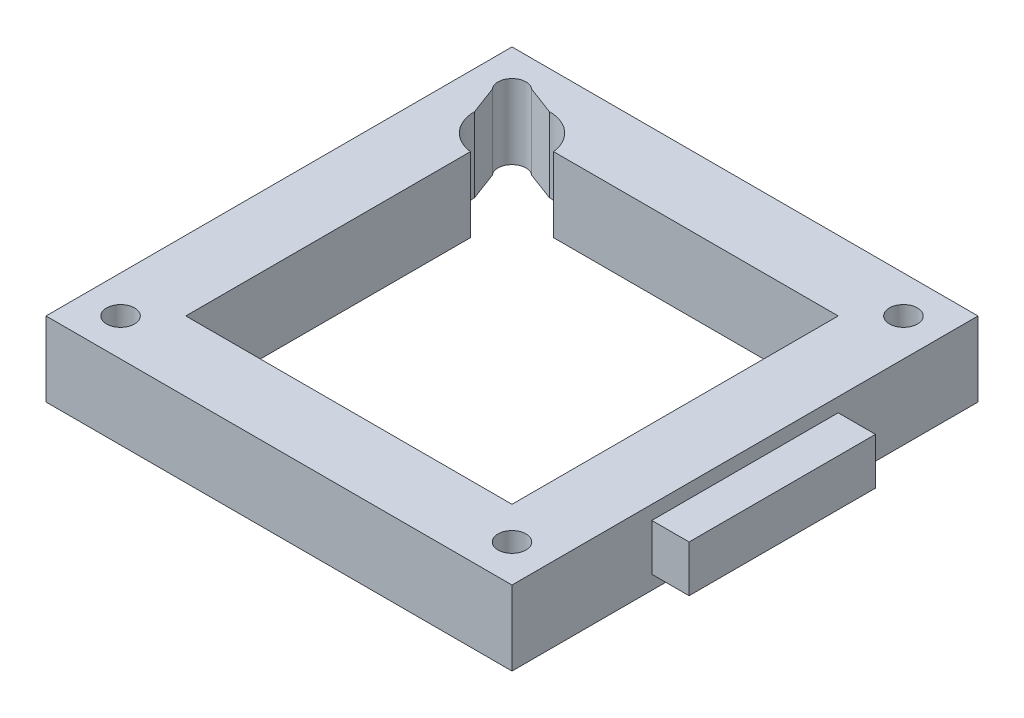
ISO-10303-21;
HEADER;
FILE_DESCRIPTION(('STEP AP214'),'2;1');
FILE_NAME('part.step','',(''),(''),'','','');
FILE_SCHEMA(('AUTOMOTIVE_DESIGN { 1 0 10303 214 1 1 1 1 }'));
ENDSEC;
DATA;
#1=APPLICATION_CONTEXT('core data for automotive mechanical design processes');
#2=APPLICATION_PROTOCOL_DEFINITION('international standard','automotive_design',2000,#1);
#3=PRODUCT_CONTEXT('',#1,'mechanical');
#4=PRODUCT('Part','Part','',(#3));
#5=PRODUCT_RELATED_PRODUCT_CATEGORY('part','',(#4));
#6=PRODUCT_DEFINITION_FORMATION('','',#4);
#7=PRODUCT_DEFINITION_CONTEXT('part definition',#1,'design');
#8=PRODUCT_DEFINITION('design','',#6,#7);
#9=PRODUCT_DEFINITION_SHAPE('','',#8);
#10=(LENGTH_UNIT() NAMED_UNIT(*) SI_UNIT(.MILLI.,.METRE.));
#11=(NAMED_UNIT(*) PLANE_ANGLE_UNIT() SI_UNIT($,.RADIAN.));
#12=(NAMED_UNIT(*) SI_UNIT($,.STERADIAN.) SOLID_ANGLE_UNIT());
#13=UNCERTAINTY_MEASURE_WITH_UNIT(LENGTH_MEASURE(1.E-05),#10,'distance_accuracy_value','');
#14=(GEOMETRIC_REPRESENTATION_CONTEXT(3) GLOBAL_UNCERTAINTY_ASSIGNED_CONTEXT((#13)) GLOBAL_UNIT_ASSIGNED_CONTEXT((#10,
#11,#12)) REPRESENTATION_CONTEXT('',''));
#15=CARTESIAN_POINT('',(0.,0.,0.));
#16=DIRECTION('',(0.,0.,1.));
#17=DIRECTION('',(1.,0.,0.));
#18=AXIS2_PLACEMENT_3D('',#15,#16,#17);
#19=CARTESIAN_POINT('',(25.,8.,0.));
#20=DIRECTION('',(-1.,0.,0.));
#21=DIRECTION('',(0.,0.,1.));
#22=AXIS2_PLACEMENT_3D('',#19,#20,#21);
#23=PLANE('',#22);
#24=DIRECTION('',(0.,0.,-1.));
#25=VECTOR('',#24,1.);
#26=CARTESIAN_POINT('',(25.,0.,0.));
#27=LINE('',#26,#25);
#28=CARTESIAN_POINT('',(25.,0.,25.));
#29=VERTEX_POINT('',#28);
#30=CARTESIAN_POINT('',(25.,0.,-25.));
#31=VERTEX_POINT('',#30);
#32=EDGE_CURVE('E437',#29,#31,#27,.T.);
#33=ORIENTED_EDGE('',*,*,#32,.T.);
#34=DIRECTION('',(0.,-1.,0.));
#35=VECTOR('',#34,1.);
#36=CARTESIAN_POINT('',(25.,8.,-25.));
#37=LINE('',#36,#35);
#38=CARTESIAN_POINT('',(25.,8.,-25.));
#39=VERTEX_POINT('',#38);
#40=EDGE_CURVE('E59',#39,#31,#37,.T.);
#41=ORIENTED_EDGE('',*,*,#40,.F.);
#42=DIRECTION('',(0.,0.,-1.));
#43=VECTOR('',#42,1.);
#44=CARTESIAN_POINT('',(25.,8.,0.));
#45=LINE('',#44,#43);
#46=CARTESIAN_POINT('',(25.,8.,25.));
#47=VERTEX_POINT('',#46);
#48=EDGE_CURVE('E377',#47,#39,#45,.T.);
#49=ORIENTED_EDGE('',*,*,#48,.F.);
#50=DIRECTION('',(0.,-1.,0.));
#51=VECTOR('',#50,1.);
#52=CARTESIAN_POINT('',(25.,8.,25.));
#53=LINE('',#52,#51);
#54=EDGE_CURVE('E11',#47,#29,#53,.T.);
#55=ORIENTED_EDGE('',*,*,#54,.T.);
#56=EDGE_LOOP('',(#33,#41,#49,#55));
#57=FACE_BOUND('',#56,.T.);
#58=DIRECTION('',(0.,0.,-1.));
#59=VECTOR('',#58,1.);
#60=CARTESIAN_POINT('',(25.,1.50000000000004,0.));
#61=LINE('',#60,#59);
#62=CARTESIAN_POINT('',(25.,1.5,10.));
#63=VERTEX_POINT('',#62);
#64=CARTESIAN_POINT('',(25.,1.50000000000007,-10.));
#65=VERTEX_POINT('',#64);
#66=EDGE_CURVE('E67',#63,#65,#61,.T.);
#67=ORIENTED_EDGE('',*,*,#66,.F.);
#68=DIRECTION('',(0.,-1.,0.));
#69=VECTOR('',#68,1.);
#70=CARTESIAN_POINT('',(25.,8.,10.));
#71=LINE('',#70,#69);
#72=CARTESIAN_POINT('',(25.,6.5,10.));
#73=VERTEX_POINT('',#72);
#74=EDGE_CURVE('E71',#73,#63,#71,.T.);
#75=ORIENTED_EDGE('',*,*,#74,.F.);
#76=DIRECTION('',(0.,0.,1.));
#77=VECTOR('',#76,1.);
#78=CARTESIAN_POINT('',(25.,6.5,0.));
#79=LINE('',#78,#77);
#80=CARTESIAN_POINT('',(25.,6.5,-10.));
#81=VERTEX_POINT('',#80);
#82=EDGE_CURVE('E997',#81,#73,#79,.T.);
#83=ORIENTED_EDGE('',*,*,#82,.F.);
#84=DIRECTION('',(0.,1.,0.));
#85=VECTOR('',#84,1.);
#86=CARTESIAN_POINT('',(25.,8.,-10.));
#87=LINE('',#86,#85);
#88=EDGE_CURVE('E1007',#65,#81,#87,.T.);
#89=ORIENTED_EDGE('',*,*,#88,.F.);
#90=EDGE_LOOP('',(#67,#75,#83,#89));
#91=FACE_BOUND('',#90,.T.);
#92=ADVANCED_FACE('F49',(#57,#91),#23,.F.);
#93=CARTESIAN_POINT('',(0.,8.,25.));
#94=DIRECTION('',(0.,0.,-1.));
#95=DIRECTION('',(-1.,0.,0.));
#96=AXIS2_PLACEMENT_3D('',#93,#94,#95);
#97=PLANE('',#96);
#98=DIRECTION('',(1.,0.,0.));
#99=VECTOR('',#98,1.);
#100=CARTESIAN_POINT('',(0.,0.,25.));
#101=LINE('',#100,#99);
#102=CARTESIAN_POINT('',(-25.,0.,25.));
#103=VERTEX_POINT('',#102);
#104=EDGE_CURVE('E433',#103,#29,#101,.T.);
#105=ORIENTED_EDGE('',*,*,#104,.T.);
#106=ORIENTED_EDGE('',*,*,#54,.F.);
#107=DIRECTION('',(1.,0.,0.));
#108=VECTOR('',#107,1.);
#109=CARTESIAN_POINT('',(0.,8.,25.));
#110=LINE('',#109,#108);
#111=CARTESIAN_POINT('',(-25.,8.,25.));
#112=VERTEX_POINT('',#111);
#113=EDGE_CURVE('E373',#112,#47,#110,.T.);
#114=ORIENTED_EDGE('',*,*,#113,.F.);
#115=DIRECTION('',(0.,-1.,0.));
#116=VECTOR('',#115,1.);
#117=CARTESIAN_POINT('',(-25.,8.,25.));
#118=LINE('',#117,#116);
#119=EDGE_CURVE('E456',#112,#103,#118,.T.);
#120=ORIENTED_EDGE('',*,*,#119,.T.);
#121=EDGE_LOOP('',(#105,#106,#114,#120));
#122=FACE_BOUND('',#121,.T.);
#123=ADVANCED_FACE('F544',(#122),#97,.F.);
#124=CARTESIAN_POINT('',(0.,8.,-25.));
#125=DIRECTION('',(0.,0.,-1.));
#126=DIRECTION('',(-1.,0.,0.));
#127=AXIS2_PLACEMENT_3D('',#124,#125,#126);
#128=PLANE('',#127);
#129=DIRECTION('',(1.,0.,0.));
#130=VECTOR('',#129,1.);
#131=CARTESIAN_POINT('',(0.,6.5000000000053,-25.));
#132=LINE('',#131,#130);
#133=CARTESIAN_POINT('',(-10.0000000000553,6.5000000000053,-25.));
#134=VERTEX_POINT('',#133);
#135=CARTESIAN_POINT('',(9.9999999999447,6.5000000000053,-25.));
#136=VERTEX_POINT('',#135);
#137=EDGE_CURVE('E283',#134,#136,#132,.T.);
#138=ORIENTED_EDGE('',*,*,#137,.F.);
#139=DIRECTION('',(0.,1.,0.));
#140=VECTOR('',#139,1.);
#141=CARTESIAN_POINT('',(-10.0000000000553,8.,-25.));
#142=LINE('',#141,#140);
#143=CARTESIAN_POINT('',(-10.0000000000553,1.5000000000053,-25.));
#144=VERTEX_POINT('',#143);
#145=EDGE_CURVE('E298',#144,#134,#142,.T.);
#146=ORIENTED_EDGE('',*,*,#145,.F.);
#147=DIRECTION('',(-1.,0.,0.));
#148=VECTOR('',#147,1.);
#149=CARTESIAN_POINT('',(0.,1.5000000000053,-25.));
#150=LINE('',#149,#148);
#151=CARTESIAN_POINT('',(9.9999999999447,1.5000000000053,-25.));
#152=VERTEX_POINT('',#151);
#153=EDGE_CURVE('E317',#152,#144,#150,.T.);
#154=ORIENTED_EDGE('',*,*,#153,.F.);
#155=DIRECTION('',(0.,-1.,0.));
#156=VECTOR('',#155,1.);
#157=CARTESIAN_POINT('',(9.9999999999447,8.,-25.));
#158=LINE('',#157,#156);
#159=EDGE_CURVE('E313',#136,#152,#158,.T.);
#160=ORIENTED_EDGE('',*,*,#159,.F.);
#161=EDGE_LOOP('',(#138,#146,#154,#160));
#162=FACE_BOUND('',#161,.T.);
#163=DIRECTION('',(1.,0.,0.));
#164=VECTOR('',#163,1.);
#165=CARTESIAN_POINT('',(0.,0.,-25.));
#166=LINE('',#165,#164);
#167=CARTESIAN_POINT('',(-25.,0.,-25.));
#168=VERTEX_POINT('',#167);
#169=EDGE_CURVE('E441',#168,#31,#166,.T.);
#170=ORIENTED_EDGE('',*,*,#169,.F.);
#171=DIRECTION('',(0.,-1.,0.));
#172=VECTOR('',#171,1.);
#173=CARTESIAN_POINT('',(-25.,8.,-25.));
#174=LINE('',#173,#172);
#175=CARTESIAN_POINT('',(-25.,8.,-25.));
#176=VERTEX_POINT('',#175);
#177=EDGE_CURVE('E459',#176,#168,#174,.T.);
#178=ORIENTED_EDGE('',*,*,#177,.F.);
#179=DIRECTION('',(1.,0.,0.));
#180=VECTOR('',#179,1.);
#181=CARTESIAN_POINT('',(0.,8.,-25.));
#182=LINE('',#181,#180);
#183=EDGE_CURVE('E380',#176,#39,#182,.T.);
#184=ORIENTED_EDGE('',*,*,#183,.T.);
#185=ORIENTED_EDGE('',*,*,#40,.T.);
#186=EDGE_LOOP('',(#170,#178,#184,#185));
#187=FACE_BOUND('',#186,.T.);
#188=ADVANCED_FACE('F542',(#162,#187),#128,.T.);
#189=CARTESIAN_POINT('',(-17.,8.,-17.));
#190=DIRECTION('',(0.,-1.,0.));
#191=DIRECTION('',(0.,0.,-1.));
#192=AXIS2_PLACEMENT_3D('',#189,#190,#191);
#193=CYLINDRICAL_SURFACE('',#192,4.);
#194=CARTESIAN_POINT('',(-17.,0.,-17.));
#195=DIRECTION('',(0.,1.,0.));
#196=DIRECTION('',(0.,0.,1.));
#197=AXIS2_PLACEMENT_3D('',#194,#195,#196);
#198=CIRCLE('',#197,4.);
#199=CARTESIAN_POINT('',(-13.0313730334031,0.,-17.5));
#200=VERTEX_POINT('',#199);
#201=CARTESIAN_POINT('',(-17.,0.,-21.));
#202=VERTEX_POINT('',#201);
#203=EDGE_CURVE('E327',#200,#202,#198,.T.);
#204=ORIENTED_EDGE('',*,*,#203,.F.);
#205=DIRECTION('',(0.,-1.,0.));
#206=VECTOR('',#205,1.);
#207=CARTESIAN_POINT('',(-13.0313730334031,8.,-17.5));
#208=LINE('',#207,#206);
#209=CARTESIAN_POINT('',(-13.0313730334031,8.,-17.5));
#210=VERTEX_POINT('',#209);
#211=EDGE_CURVE('E53',#210,#200,#208,.T.);
#212=ORIENTED_EDGE('',*,*,#211,.F.);
#213=CARTESIAN_POINT('',(-17.,8.,-17.));
#214=DIRECTION('',(0.,1.,0.));
#215=DIRECTION('',(0.,0.,1.));
#216=AXIS2_PLACEMENT_3D('',#213,#214,#215);
#217=CIRCLE('',#216,4.);
#218=CARTESIAN_POINT('',(-17.,8.,-21.));
#219=VERTEX_POINT('',#218);
#220=EDGE_CURVE('E337',#210,#219,#217,.T.);
#221=ORIENTED_EDGE('',*,*,#220,.T.);
#222=DIRECTION('',(0.,-1.,0.));
#223=VECTOR('',#222,1.);
#224=CARTESIAN_POINT('',(-17.,8.,-21.));
#225=LINE('',#224,#223);
#226=EDGE_CURVE('E396',#219,#202,#225,.T.);
#227=ORIENTED_EDGE('',*,*,#226,.T.);
#228=EDGE_LOOP('',(#204,#212,#221,#227));
#229=FACE_BOUND('',#228,.T.);
#230=ADVANCED_FACE('F494',(#229),#193,.F.);
#231=CARTESIAN_POINT('',(0.,8.,-17.5));
#232=DIRECTION('',(0.,0.,1.));
#233=DIRECTION('',(1.,0.,0.));
#234=AXIS2_PLACEMENT_3D('',#231,#232,#233);
#235=PLANE('',#234);
#236=DIRECTION('',(-1.,0.,0.));
#237=VECTOR('',#236,1.);
#238=CARTESIAN_POINT('',(0.,0.,-17.5));
#239=LINE('',#238,#237);
#240=CARTESIAN_POINT('',(17.5,0.,-17.5));
#241=VERTEX_POINT('',#240);
#242=EDGE_CURVE('E400',#241,#200,#239,.T.);
#243=ORIENTED_EDGE('',*,*,#242,.F.);
#244=DIRECTION('',(0.,-1.,0.));
#245=VECTOR('',#244,1.);
#246=CARTESIAN_POINT('',(17.5,8.,-17.5));
#247=LINE('',#246,#245);
#248=CARTESIAN_POINT('',(17.5,8.,-17.5));
#249=VERTEX_POINT('',#248);
#250=EDGE_CURVE('E483',#249,#241,#247,.T.);
#251=ORIENTED_EDGE('',*,*,#250,.F.);
#252=DIRECTION('',(-1.,0.,0.));
#253=VECTOR('',#252,1.);
#254=CARTESIAN_POINT('',(0.,8.,-17.5));
#255=LINE('',#254,#253);
#256=EDGE_CURVE('E341',#249,#210,#255,.T.);
#257=ORIENTED_EDGE('',*,*,#256,.T.);
#258=ORIENTED_EDGE('',*,*,#211,.T.);
#259=EDGE_LOOP('',(#243,#251,#257,#258));
#260=FACE_BOUND('',#259,.T.);
#261=ADVANCED_FACE('F51',(#260),#235,.T.);
#262=CARTESIAN_POINT('',(17.5,8.,0.));
#263=DIRECTION('',(-1.,0.,0.));
#264=DIRECTION('',(0.,0.,1.));
#265=AXIS2_PLACEMENT_3D('',#262,#263,#264);
#266=PLANE('',#265);
#267=DIRECTION('',(0.,0.,-1.));
#268=VECTOR('',#267,1.);
#269=CARTESIAN_POINT('',(17.5,0.,0.));
#270=LINE('',#269,#268);
#271=CARTESIAN_POINT('',(17.5,0.,17.5));
#272=VERTEX_POINT('',#271);
#273=EDGE_CURVE('E405',#272,#241,#270,.T.);
#274=ORIENTED_EDGE('',*,*,#273,.F.);
#275=DIRECTION('',(0.,-1.,0.));
#276=VECTOR('',#275,1.);
#277=CARTESIAN_POINT('',(17.5,8.,17.5));
#278=LINE('',#277,#276);
#279=CARTESIAN_POINT('',(17.5,8.,17.5));
#280=VERTEX_POINT('',#279);
#281=EDGE_CURVE('E481',#280,#272,#278,.T.);
#282=ORIENTED_EDGE('',*,*,#281,.F.);
#283=DIRECTION('',(0.,0.,-1.));
#284=VECTOR('',#283,1.);
#285=CARTESIAN_POINT('',(17.5,8.,0.));
#286=LINE('',#285,#284);
#287=EDGE_CURVE('E347',#280,#249,#286,.T.);
#288=ORIENTED_EDGE('',*,*,#287,.T.);
#289=ORIENTED_EDGE('',*,*,#250,.T.);
#290=EDGE_LOOP('',(#274,#282,#288,#289));
#291=FACE_BOUND('',#290,.T.);
#292=ADVANCED_FACE('F502',(#291),#266,.T.);
#293=CARTESIAN_POINT('',(0.,8.,17.5));
#294=DIRECTION('',(0.,0.,-1.));
#295=DIRECTION('',(-1.,0.,0.));
#296=AXIS2_PLACEMENT_3D('',#293,#294,#295);
#297=PLANE('',#296);
#298=DIRECTION('',(1.,0.,0.));
#299=VECTOR('',#298,1.);
#300=CARTESIAN_POINT('',(0.,0.,17.5));
#301=LINE('',#300,#299);
#302=CARTESIAN_POINT('',(-17.5,0.,17.5));
#303=VERTEX_POINT('',#302);
#304=EDGE_CURVE('E409',#303,#272,#301,.T.);
#305=ORIENTED_EDGE('',*,*,#304,.F.);
#306=DIRECTION('',(0.,-1.,0.));
#307=VECTOR('',#306,1.);
#308=CARTESIAN_POINT('',(-17.5,8.,17.5));
#309=LINE('',#308,#307);
#310=CARTESIAN_POINT('',(-17.5,8.,17.5));
#311=VERTEX_POINT('',#310);
#312=EDGE_CURVE('E478',#311,#303,#309,.T.);
#313=ORIENTED_EDGE('',*,*,#312,.F.);
#314=DIRECTION('',(1.,0.,0.));
#315=VECTOR('',#314,1.);
#316=CARTESIAN_POINT('',(0.,8.,17.5));
#317=LINE('',#316,#315);
#318=EDGE_CURVE('E351',#311,#280,#317,.T.);
#319=ORIENTED_EDGE('',*,*,#318,.T.);
#320=ORIENTED_EDGE('',*,*,#281,.T.);
#321=EDGE_LOOP('',(#305,#313,#319,#320));
#322=FACE_BOUND('',#321,.T.);
#323=ADVANCED_FACE('F509',(#322),#297,.T.);
#324=CARTESIAN_POINT('',(-17.5,8.,0.));
#325=DIRECTION('',(-1.,0.,0.));
#326=DIRECTION('',(0.,0.,1.));
#327=AXIS2_PLACEMENT_3D('',#324,#325,#326);
#328=PLANE('',#327);
#329=DIRECTION('',(0.,0.,-1.));
#330=VECTOR('',#329,1.);
#331=CARTESIAN_POINT('',(-17.5,0.,0.));
#332=LINE('',#331,#330);
#333=CARTESIAN_POINT('',(-17.5,0.,-13.0313730334031));
#334=VERTEX_POINT('',#333);
#335=EDGE_CURVE('E413',#303,#334,#332,.T.);
#336=ORIENTED_EDGE('',*,*,#335,.T.);
#337=DIRECTION('',(0.,-1.,0.));
#338=VECTOR('',#337,1.);
#339=CARTESIAN_POINT('',(-17.5,8.,-13.0313730334031));
#340=LINE('',#339,#338);
#341=CARTESIAN_POINT('',(-17.5,8.,-13.0313730334031));
#342=VERTEX_POINT('',#341);
#343=EDGE_CURVE('E475',#342,#334,#340,.T.);
#344=ORIENTED_EDGE('',*,*,#343,.F.);
#345=DIRECTION('',(0.,0.,-1.));
#346=VECTOR('',#345,1.);
#347=CARTESIAN_POINT('',(-17.5,8.,0.));
#348=LINE('',#347,#346);
#349=EDGE_CURVE('E355',#311,#342,#348,.T.);
#350=ORIENTED_EDGE('',*,*,#349,.F.);
#351=ORIENTED_EDGE('',*,*,#312,.T.);
#352=EDGE_LOOP('',(#336,#344,#350,#351));
#353=FACE_BOUND('',#352,.T.);
#354=ADVANCED_FACE('F513',(#353),#328,.F.);
#355=CARTESIAN_POINT('',(-21.,0.,-17.));
#356=VERTEX_POINT('',#355);
#357=EDGE_CURVE('E401',#356,#334,#198,.T.);
#358=ORIENTED_EDGE('',*,*,#357,.F.);
#359=DIRECTION('',(0.,-1.,0.));
#360=VECTOR('',#359,1.);
#361=CARTESIAN_POINT('',(-21.,8.,-17.));
#362=LINE('',#361,#360);
#363=CARTESIAN_POINT('',(-21.,8.,-17.));
#364=VERTEX_POINT('',#363);
#365=EDGE_CURVE('E472',#364,#356,#362,.T.);
#366=ORIENTED_EDGE('',*,*,#365,.F.);
#367=EDGE_CURVE('E343',#364,#342,#217,.T.);
#368=ORIENTED_EDGE('',*,*,#367,.T.);
#369=ORIENTED_EDGE('',*,*,#343,.T.);
#370=EDGE_LOOP('',(#358,#366,#368,#369));
#371=FACE_BOUND('',#370,.T.);
#372=ADVANCED_FACE('F532',(#371),#193,.F.);
#373=CARTESIAN_POINT('',(-12.8219178082192,8.,4.80821917808219));
#374=DIRECTION('',(0.936329177569045,0.,-0.351123441588392));
#375=DIRECTION('',(-0.351123441588392,0.,-0.936329177569045));
#376=AXIS2_PLACEMENT_3D('',#373,#374,#375);
#377=PLANE('',#376);
#378=DIRECTION('',(0.351123441588392,0.,0.936329177569044));
#379=VECTOR('',#378,1.);
#380=CARTESIAN_POINT('',(-12.8219178082192,0.,4.80821917808219));
#381=LINE('',#380,#379);
#382=CARTESIAN_POINT('',(-22.1301369863014,0.,-20.013698630137));
#383=VERTEX_POINT('',#382);
#384=EDGE_CURVE('E417',#383,#356,#381,.T.);
#385=ORIENTED_EDGE('',*,*,#384,.F.);
#386=DIRECTION('',(0.,-1.,0.));
#387=VECTOR('',#386,1.);
#388=CARTESIAN_POINT('',(-22.1301369863014,8.,-20.013698630137));
#389=LINE('',#388,#387);
#390=CARTESIAN_POINT('',(-22.1301369863014,8.,-20.013698630137));
#391=VERTEX_POINT('',#390);
#392=EDGE_CURVE('E469',#391,#383,#389,.T.);
#393=ORIENTED_EDGE('',*,*,#392,.F.);
#394=DIRECTION('',(0.351123441588392,0.,0.936329177569044));
#395=VECTOR('',#394,1.);
#396=CARTESIAN_POINT('',(-12.8219178082192,8.,4.80821917808219));
#397=LINE('',#396,#395);
#398=EDGE_CURVE('E358',#391,#364,#397,.T.);
#399=ORIENTED_EDGE('',*,*,#398,.T.);
#400=ORIENTED_EDGE('',*,*,#365,.T.);
#401=EDGE_LOOP('',(#385,#393,#399,#400));
#402=FACE_BOUND('',#401,.T.);
#403=ADVANCED_FACE('F522',(#402),#377,.T.);
#404=CARTESIAN_POINT('',(-21.,8.,-21.));
#405=DIRECTION('',(0.,-1.,0.));
#406=DIRECTION('',(0.,0.,-1.));
#407=AXIS2_PLACEMENT_3D('',#404,#405,#406);
#408=CYLINDRICAL_SURFACE('',#407,1.5);
#409=CARTESIAN_POINT('',(-21.,0.,-21.));
#410=DIRECTION('',(0.,1.,0.));
#411=DIRECTION('',(0.,0.,1.));
#412=AXIS2_PLACEMENT_3D('',#409,#410,#411);
#413=CIRCLE('',#412,1.5);
#414=CARTESIAN_POINT('',(-20.013698630137,0.,-22.1301369863014));
#415=VERTEX_POINT('',#414);
#416=EDGE_CURVE('E421',#415,#383,#413,.T.);
#417=ORIENTED_EDGE('',*,*,#416,.F.);
#418=DIRECTION('',(0.,-1.,0.));
#419=VECTOR('',#418,1.);
#420=CARTESIAN_POINT('',(-20.013698630137,8.,-22.1301369863014));
#421=LINE('',#420,#419);
#422=CARTESIAN_POINT('',(-20.013698630137,8.,-22.1301369863014));
#423=VERTEX_POINT('',#422);
#424=EDGE_CURVE('E466',#423,#415,#421,.T.);
#425=ORIENTED_EDGE('',*,*,#424,.F.);
#426=CARTESIAN_POINT('',(-21.,8.,-21.));
#427=DIRECTION('',(0.,1.,0.));
#428=DIRECTION('',(0.,0.,1.));
#429=AXIS2_PLACEMENT_3D('',#426,#427,#428);
#430=CIRCLE('',#429,1.5);
#431=EDGE_CURVE('E362',#423,#391,#430,.T.);
#432=ORIENTED_EDGE('',*,*,#431,.T.);
#433=ORIENTED_EDGE('',*,*,#392,.T.);
#434=EDGE_LOOP('',(#417,#425,#432,#433));
#435=FACE_BOUND('',#434,.T.);
#436=ADVANCED_FACE('F526',(#435),#408,.F.);
#437=CARTESIAN_POINT('',(21.,8.,21.));
#438=DIRECTION('',(0.,-1.,0.));
#439=DIRECTION('',(0.,0.,-1.));
#440=AXIS2_PLACEMENT_3D('',#437,#438,#439);
#441=CYLINDRICAL_SURFACE('',#440,1.5);
#442=CARTESIAN_POINT('',(21.,8.,21.));
#443=DIRECTION('',(0.,1.,0.));
#444=DIRECTION('',(0.,0.,1.));
#445=AXIS2_PLACEMENT_3D('',#442,#443,#444);
#446=CIRCLE('',#445,1.5);
#447=CARTESIAN_POINT('',(21.,8.,22.5));
#448=VERTEX_POINT('',#447);
#449=EDGE_CURVE('E388',#448,#448,#446,.T.);
#450=ORIENTED_EDGE('',*,*,#449,.T.);
#451=EDGE_LOOP('',(#450));
#452=FACE_BOUND('',#451,.T.);
#453=CARTESIAN_POINT('',(21.,0.,21.));
#454=DIRECTION('',(0.,1.,0.));
#455=DIRECTION('',(0.,0.,1.));
#456=AXIS2_PLACEMENT_3D('',#453,#454,#455);
#457=CIRCLE('',#456,1.5);
#458=CARTESIAN_POINT('',(21.,0.,22.5));
#459=VERTEX_POINT('',#458);
#460=EDGE_CURVE('E449',#459,#459,#457,.T.);
#461=ORIENTED_EDGE('',*,*,#460,.F.);
#462=EDGE_LOOP('',(#461));
#463=FACE_BOUND('',#462,.T.);
#464=ADVANCED_FACE('F566',(#452,#463),#441,.F.);
#465=CARTESIAN_POINT('',(-25.,8.,0.));
#466=DIRECTION('',(-1.,0.,0.));
#467=DIRECTION('',(0.,0.,1.));
#468=AXIS2_PLACEMENT_3D('',#465,#466,#467);
#469=PLANE('',#468);
#470=DIRECTION('',(0.,0.,-1.));
#471=VECTOR('',#470,1.);
#472=CARTESIAN_POINT('',(-25.,6.5,0.));
#473=LINE('',#472,#471);
#474=CARTESIAN_POINT('',(-25.,6.5,10.));
#475=VERTEX_POINT('',#474);
#476=CARTESIAN_POINT('',(-25.,6.5,-10.));
#477=VERTEX_POINT('',#476);
#478=EDGE_CURVE('E242',#475,#477,#473,.T.);
#479=ORIENTED_EDGE('',*,*,#478,.F.);
#480=DIRECTION('',(0.,1.,0.));
#481=VECTOR('',#480,1.);
#482=CARTESIAN_POINT('',(-25.,8.,10.));
#483=LINE('',#482,#481);
#484=CARTESIAN_POINT('',(-25.,1.5,10.));
#485=VERTEX_POINT('',#484);
#486=EDGE_CURVE('E257',#485,#475,#483,.T.);
#487=ORIENTED_EDGE('',*,*,#486,.F.);
#488=DIRECTION('',(0.,0.,1.));
#489=VECTOR('',#488,1.);
#490=CARTESIAN_POINT('',(-25.,1.50000000000004,0.));
#491=LINE('',#490,#489);
#492=CARTESIAN_POINT('',(-25.,1.50000000000007,-10.));
#493=VERTEX_POINT('',#492);
#494=EDGE_CURVE('E273',#493,#485,#491,.T.);
#495=ORIENTED_EDGE('',*,*,#494,.F.);
#496=DIRECTION('',(0.,-1.,0.));
#497=VECTOR('',#496,1.);
#498=CARTESIAN_POINT('',(-25.,8.,-10.));
#499=LINE('',#498,#497);
#500=EDGE_CURVE('E246',#477,#493,#499,.T.);
#501=ORIENTED_EDGE('',*,*,#500,.F.);
#502=EDGE_LOOP('',(#479,#487,#495,#501));
#503=FACE_BOUND('',#502,.T.);
#504=DIRECTION('',(0.,0.,-1.));
#505=VECTOR('',#504,1.);
#506=CARTESIAN_POINT('',(-25.,0.,0.));
#507=LINE('',#506,#505);
#508=EDGE_CURVE('E445',#103,#168,#507,.T.);
#509=ORIENTED_EDGE('',*,*,#508,.F.);
#510=ORIENTED_EDGE('',*,*,#119,.F.);
#511=DIRECTION('',(0.,0.,-1.));
#512=VECTOR('',#511,1.);
#513=CARTESIAN_POINT('',(-25.,8.,0.));
#514=LINE('',#513,#512);
#515=EDGE_CURVE('E384',#112,#176,#514,.T.);
#516=ORIENTED_EDGE('',*,*,#515,.T.);
#517=ORIENTED_EDGE('',*,*,#177,.T.);
#518=EDGE_LOOP('',(#509,#510,#516,#517));
#519=FACE_BOUND('',#518,.T.);
#520=ADVANCED_FACE('F560',(#503,#519),#469,.T.);
#521=CARTESIAN_POINT('',(21.,8.,-21.));
#522=DIRECTION('',(0.,-1.,0.));
#523=DIRECTION('',(0.,0.,-1.));
#524=AXIS2_PLACEMENT_3D('',#521,#522,#523);
#525=CYLINDRICAL_SURFACE('',#524,1.5);
#526=CARTESIAN_POINT('',(21.,8.,-21.));
#527=DIRECTION('',(0.,1.,0.));
#528=DIRECTION('',(0.,0.,1.));
#529=AXIS2_PLACEMENT_3D('',#526,#527,#528);
#530=CIRCLE('',#529,1.5);
#531=CARTESIAN_POINT('',(21.,8.,-19.5));
#532=VERTEX_POINT('',#531);
#533=EDGE_CURVE('E369',#532,#532,#530,.F.);
#534=ORIENTED_EDGE('',*,*,#533,.F.);
#535=EDGE_LOOP('',(#534));
#536=FACE_BOUND('',#535,.T.);
#537=CARTESIAN_POINT('',(21.,0.,-21.));
#538=DIRECTION('',(0.,1.,0.));
#539=DIRECTION('',(0.,0.,1.));
#540=AXIS2_PLACEMENT_3D('',#537,#538,#539);
#541=CIRCLE('',#540,1.5);
#542=CARTESIAN_POINT('',(21.,0.,-19.5));
#543=VERTEX_POINT('',#542);
#544=EDGE_CURVE('E429',#543,#543,#541,.F.);
#545=ORIENTED_EDGE('',*,*,#544,.T.);
#546=EDGE_LOOP('',(#545));
#547=FACE_BOUND('',#546,.T.);
#548=ADVANCED_FACE('F557',(#536,#547),#525,.F.);
#549=CARTESIAN_POINT('',(4.80821917808219,8.,-12.8219178082192));
#550=DIRECTION('',(0.351123441588392,0.,-0.936329177569045));
#551=DIRECTION('',(-0.936329177569045,0.,-0.351123441588392));
#552=AXIS2_PLACEMENT_3D('',#549,#550,#551);
#553=PLANE('',#552);
#554=DIRECTION('',(0.936329177569044,0.,0.351123441588392));
#555=VECTOR('',#554,1.);
#556=CARTESIAN_POINT('',(4.80821917808219,0.,-12.8219178082192));
#557=LINE('',#556,#555);
#558=EDGE_CURVE('E425',#415,#202,#557,.T.);
#559=ORIENTED_EDGE('',*,*,#558,.T.);
#560=ORIENTED_EDGE('',*,*,#226,.F.);
#561=DIRECTION('',(0.936329177569044,0.,0.351123441588392));
#562=VECTOR('',#561,1.);
#563=CARTESIAN_POINT('',(4.80821917808219,8.,-12.8219178082192));
#564=LINE('',#563,#562);
#565=EDGE_CURVE('E366',#423,#219,#564,.T.);
#566=ORIENTED_EDGE('',*,*,#565,.F.);
#567=ORIENTED_EDGE('',*,*,#424,.T.);
#568=EDGE_LOOP('',(#559,#560,#566,#567));
#569=FACE_BOUND('',#568,.T.);
#570=ADVANCED_FACE('F529',(#569),#553,.F.);
#571=CARTESIAN_POINT('',(-21.,8.,21.));
#572=DIRECTION('',(0.,-1.,0.));
#573=DIRECTION('',(0.,0.,-1.));
#574=AXIS2_PLACEMENT_3D('',#571,#572,#573);
#575=CYLINDRICAL_SURFACE('',#574,1.5);
#576=CARTESIAN_POINT('',(-21.,8.,21.));
#577=DIRECTION('',(0.,1.,0.));
#578=DIRECTION('',(0.,0.,1.));
#579=AXIS2_PLACEMENT_3D('',#576,#577,#578);
#580=CIRCLE('',#579,1.5);
#581=CARTESIAN_POINT('',(-21.,8.,22.5));
#582=VERTEX_POINT('',#581);
#583=EDGE_CURVE('E392',#582,#582,#580,.F.);
#584=ORIENTED_EDGE('',*,*,#583,.F.);
#585=EDGE_LOOP('',(#584));
#586=FACE_BOUND('',#585,.T.);
#587=CARTESIAN_POINT('',(-21.,0.,21.));
#588=DIRECTION('',(0.,1.,0.));
#589=DIRECTION('',(0.,0.,1.));
#590=AXIS2_PLACEMENT_3D('',#587,#588,#589);
#591=CIRCLE('',#590,1.5);
#592=CARTESIAN_POINT('',(-21.,0.,22.5));
#593=VERTEX_POINT('',#592);
#594=EDGE_CURVE('E342',#593,#593,#591,.F.);
#595=ORIENTED_EDGE('',*,*,#594,.T.);
#596=EDGE_LOOP('',(#595));
#597=FACE_BOUND('',#596,.T.);
#598=ADVANCED_FACE('F564',(#586,#597),#575,.F.);
#599=CARTESIAN_POINT('',(0.,8.,0.));
#600=DIRECTION('',(0.,1.,0.));
#601=DIRECTION('',(0.,0.,1.));
#602=AXIS2_PLACEMENT_3D('',#599,#600,#601);
#603=PLANE('',#602);
#604=ORIENTED_EDGE('',*,*,#220,.F.);
#605=ORIENTED_EDGE('',*,*,#256,.F.);
#606=ORIENTED_EDGE('',*,*,#287,.F.);
#607=ORIENTED_EDGE('',*,*,#318,.F.);
#608=ORIENTED_EDGE('',*,*,#349,.T.);
#609=ORIENTED_EDGE('',*,*,#367,.F.);
#610=ORIENTED_EDGE('',*,*,#398,.F.);
#611=ORIENTED_EDGE('',*,*,#431,.F.);
#612=ORIENTED_EDGE('',*,*,#565,.T.);
#613=EDGE_LOOP('',(#604,#605,#606,#607,#608,#609,#610,#611,#612));
#614=FACE_BOUND('',#613,.T.);
#615=ORIENTED_EDGE('',*,*,#533,.T.);
#616=EDGE_LOOP('',(#615));
#617=FACE_BOUND('',#616,.T.);
#618=ORIENTED_EDGE('',*,*,#113,.T.);
#619=ORIENTED_EDGE('',*,*,#48,.T.);
#620=ORIENTED_EDGE('',*,*,#183,.F.);
#621=ORIENTED_EDGE('',*,*,#515,.F.);
#622=EDGE_LOOP('',(#618,#619,#620,#621));
#623=FACE_BOUND('',#622,.T.);
#624=ORIENTED_EDGE('',*,*,#449,.F.);
#625=EDGE_LOOP('',(#624));
#626=FACE_BOUND('',#625,.T.);
#627=ORIENTED_EDGE('',*,*,#583,.T.);
#628=EDGE_LOOP('',(#627));
#629=FACE_BOUND('',#628,.T.);
#630=ADVANCED_FACE('F507',(#614,#617,#623,#626,#629),#603,.T.);
#631=CARTESIAN_POINT('',(0.,0.,0.));
#632=DIRECTION('',(0.,1.,0.));
#633=DIRECTION('',(0.,0.,1.));
#634=AXIS2_PLACEMENT_3D('',#631,#632,#633);
#635=PLANE('',#634);
#636=ORIENTED_EDGE('',*,*,#203,.T.);
#637=ORIENTED_EDGE('',*,*,#558,.F.);
#638=ORIENTED_EDGE('',*,*,#416,.T.);
#639=ORIENTED_EDGE('',*,*,#384,.T.);
#640=ORIENTED_EDGE('',*,*,#357,.T.);
#641=ORIENTED_EDGE('',*,*,#335,.F.);
#642=ORIENTED_EDGE('',*,*,#304,.T.);
#643=ORIENTED_EDGE('',*,*,#273,.T.);
#644=ORIENTED_EDGE('',*,*,#242,.T.);
#645=EDGE_LOOP('',(#636,#637,#638,#639,#640,#641,#642,#643,#644));
#646=FACE_BOUND('',#645,.T.);
#647=ORIENTED_EDGE('',*,*,#544,.F.);
#648=EDGE_LOOP('',(#647));
#649=FACE_BOUND('',#648,.T.);
#650=ORIENTED_EDGE('',*,*,#104,.F.);
#651=ORIENTED_EDGE('',*,*,#508,.T.);
#652=ORIENTED_EDGE('',*,*,#169,.T.);
#653=ORIENTED_EDGE('',*,*,#32,.F.);
#654=EDGE_LOOP('',(#650,#651,#652,#653));
#655=FACE_BOUND('',#654,.T.);
#656=ORIENTED_EDGE('',*,*,#460,.T.);
#657=EDGE_LOOP('',(#656));
#658=FACE_BOUND('',#657,.T.);
#659=ORIENTED_EDGE('',*,*,#594,.F.);
#660=EDGE_LOOP('',(#659));
#661=FACE_BOUND('',#660,.T.);
#662=ADVANCED_FACE('F498',(#646,#649,#655,#658,#661),#635,.F.);
#663=CARTESIAN_POINT('',(0.,6.5000000000053,-21.));
#664=DIRECTION('',(0.,1.,0.));
#665=DIRECTION('',(0.,0.,1.));
#666=AXIS2_PLACEMENT_3D('',#663,#664,#665);
#667=PLANE('',#666);
#668=ORIENTED_EDGE('',*,*,#137,.T.);
#669=DIRECTION('',(0.,0.,-1.));
#670=VECTOR('',#669,1.);
#671=CARTESIAN_POINT('',(9.9999999999447,6.5000000000053,-21.));
#672=LINE('',#671,#670);
#673=CARTESIAN_POINT('',(9.9999999999447,6.5000000000053,-21.));
#674=VERTEX_POINT('',#673);
#675=EDGE_CURVE('E310',#674,#136,#672,.T.);
#676=ORIENTED_EDGE('',*,*,#675,.F.);
#677=DIRECTION('',(1.,0.,0.));
#678=VECTOR('',#677,1.);
#679=CARTESIAN_POINT('',(0.,6.5000000000053,-21.));
#680=LINE('',#679,#678);
#681=CARTESIAN_POINT('',(-10.0000000000553,6.5000000000053,-21.));
#682=VERTEX_POINT('',#681);
#683=EDGE_CURVE('E293',#682,#674,#680,.T.);
#684=ORIENTED_EDGE('',*,*,#683,.F.);
#685=DIRECTION('',(0.,0.,-1.));
#686=VECTOR('',#685,1.);
#687=CARTESIAN_POINT('',(-10.0000000000553,6.5000000000053,-21.));
#688=LINE('',#687,#686);
#689=EDGE_CURVE('E324',#682,#134,#688,.T.);
#690=ORIENTED_EDGE('',*,*,#689,.T.);
#691=EDGE_LOOP('',(#668,#676,#684,#690));
#692=FACE_BOUND('',#691,.T.);
#693=ADVANCED_FACE('F584',(#692),#667,.F.);
#694=CARTESIAN_POINT('',(-10.0000000000553,8.,-21.));
#695=DIRECTION('',(-1.,0.,0.));
#696=DIRECTION('',(0.,0.,1.));
#697=AXIS2_PLACEMENT_3D('',#694,#695,#696);
#698=PLANE('',#697);
#699=ORIENTED_EDGE('',*,*,#145,.T.);
#700=ORIENTED_EDGE('',*,*,#689,.F.);
#701=DIRECTION('',(0.,1.,0.));
#702=VECTOR('',#701,1.);
#703=CARTESIAN_POINT('',(-10.0000000000553,8.,-21.));
#704=LINE('',#703,#702);
#705=CARTESIAN_POINT('',(-10.0000000000553,1.5000000000053,-21.));
#706=VERTEX_POINT('',#705);
#707=EDGE_CURVE('E306',#706,#682,#704,.T.);
#708=ORIENTED_EDGE('',*,*,#707,.F.);
#709=DIRECTION('',(0.,0.,-1.));
#710=VECTOR('',#709,1.);
#711=CARTESIAN_POINT('',(-10.0000000000553,1.5000000000053,-21.));
#712=LINE('',#711,#710);
#713=EDGE_CURVE('E328',#706,#144,#712,.T.);
#714=ORIENTED_EDGE('',*,*,#713,.T.);
#715=EDGE_LOOP('',(#699,#700,#708,#714));
#716=FACE_BOUND('',#715,.T.);
#717=ADVANCED_FACE('F589',(#716),#698,.F.);
#718=CARTESIAN_POINT('',(0.,1.5000000000053,-21.));
#719=DIRECTION('',(0.,-1.,0.));
#720=DIRECTION('',(0.,0.,-1.));
#721=AXIS2_PLACEMENT_3D('',#718,#719,#720);
#722=PLANE('',#721);
#723=ORIENTED_EDGE('',*,*,#153,.T.);
#724=ORIENTED_EDGE('',*,*,#713,.F.);
#725=DIRECTION('',(-1.,0.,0.));
#726=VECTOR('',#725,1.);
#727=CARTESIAN_POINT('',(0.,1.5000000000053,-21.));
#728=LINE('',#727,#726);
#729=CARTESIAN_POINT('',(9.9999999999447,1.5000000000053,-21.));
#730=VERTEX_POINT('',#729);
#731=EDGE_CURVE('E302',#730,#706,#728,.T.);
#732=ORIENTED_EDGE('',*,*,#731,.F.);
#733=DIRECTION('',(0.,0.,-1.));
#734=VECTOR('',#733,1.);
#735=CARTESIAN_POINT('',(9.9999999999447,1.5000000000053,-21.));
#736=LINE('',#735,#734);
#737=EDGE_CURVE('E331',#730,#152,#736,.T.);
#738=ORIENTED_EDGE('',*,*,#737,.T.);
#739=EDGE_LOOP('',(#723,#724,#732,#738));
#740=FACE_BOUND('',#739,.T.);
#741=ADVANCED_FACE('F595',(#740),#722,.F.);
#742=CARTESIAN_POINT('',(9.9999999999447,8.,-21.));
#743=DIRECTION('',(1.,0.,0.));
#744=DIRECTION('',(0.,0.,-1.));
#745=AXIS2_PLACEMENT_3D('',#742,#743,#744);
#746=PLANE('',#745);
#747=ORIENTED_EDGE('',*,*,#159,.T.);
#748=ORIENTED_EDGE('',*,*,#737,.F.);
#749=DIRECTION('',(0.,-1.,0.));
#750=VECTOR('',#749,1.);
#751=CARTESIAN_POINT('',(9.9999999999447,8.,-21.));
#752=LINE('',#751,#750);
#753=EDGE_CURVE('E297',#674,#730,#752,.T.);
#754=ORIENTED_EDGE('',*,*,#753,.F.);
#755=ORIENTED_EDGE('',*,*,#675,.T.);
#756=EDGE_LOOP('',(#747,#748,#754,#755));
#757=FACE_BOUND('',#756,.T.);
#758=ADVANCED_FACE('F591',(#757),#746,.F.);
#759=CARTESIAN_POINT('',(0.,0.,-21.));
#760=DIRECTION('',(0.,0.,-1.));
#761=DIRECTION('',(-1.,0.,0.));
#762=AXIS2_PLACEMENT_3D('',#759,#760,#761);
#763=PLANE('',#762);
#764=ORIENTED_EDGE('',*,*,#683,.T.);
#765=ORIENTED_EDGE('',*,*,#753,.T.);
#766=ORIENTED_EDGE('',*,*,#731,.T.);
#767=ORIENTED_EDGE('',*,*,#707,.T.);
#768=EDGE_LOOP('',(#764,#765,#766,#767));
#769=FACE_BOUND('',#768,.T.);
#770=ADVANCED_FACE('F594',(#769),#763,.T.);
#771=CARTESIAN_POINT('',(-21.,6.5,0.));
#772=DIRECTION('',(0.,1.,0.));
#773=DIRECTION('',(0.,0.,1.));
#774=AXIS2_PLACEMENT_3D('',#771,#772,#773);
#775=PLANE('',#774);
#776=ORIENTED_EDGE('',*,*,#478,.T.);
#777=DIRECTION('',(-1.,0.,0.));
#778=VECTOR('',#777,1.);
#779=CARTESIAN_POINT('',(-21.,6.5,-10.));
#780=LINE('',#779,#778);
#781=CARTESIAN_POINT('',(-21.,6.5,-10.));
#782=VERTEX_POINT('',#781);
#783=EDGE_CURVE('E268',#782,#477,#780,.T.);
#784=ORIENTED_EDGE('',*,*,#783,.F.);
#785=DIRECTION('',(0.,0.,-1.));
#786=VECTOR('',#785,1.);
#787=CARTESIAN_POINT('',(-21.,6.5,0.));
#788=LINE('',#787,#786);
#789=CARTESIAN_POINT('',(-21.,6.5,10.));
#790=VERTEX_POINT('',#789);
#791=EDGE_CURVE('E252',#790,#782,#788,.T.);
#792=ORIENTED_EDGE('',*,*,#791,.F.);
#793=DIRECTION('',(-1.,0.,0.));
#794=VECTOR('',#793,1.);
#795=CARTESIAN_POINT('',(-21.,6.5,10.));
#796=LINE('',#795,#794);
#797=EDGE_CURVE('E280',#790,#475,#796,.T.);
#798=ORIENTED_EDGE('',*,*,#797,.T.);
#799=EDGE_LOOP('',(#776,#784,#792,#798));
#800=FACE_BOUND('',#799,.T.);
#801=ADVANCED_FACE('F605',(#800),#775,.F.);
#802=CARTESIAN_POINT('',(-21.,8.,10.));
#803=DIRECTION('',(0.,0.,1.));
#804=DIRECTION('',(1.,0.,0.));
#805=AXIS2_PLACEMENT_3D('',#802,#803,#804);
#806=PLANE('',#805);
#807=ORIENTED_EDGE('',*,*,#486,.T.);
#808=ORIENTED_EDGE('',*,*,#797,.F.);
#809=DIRECTION('',(0.,1.,0.));
#810=VECTOR('',#809,1.);
#811=CARTESIAN_POINT('',(-21.,8.,10.));
#812=LINE('',#811,#810);
#813=CARTESIAN_POINT('',(-21.,1.5,10.));
#814=VERTEX_POINT('',#813);
#815=EDGE_CURVE('E265',#814,#790,#812,.T.);
#816=ORIENTED_EDGE('',*,*,#815,.F.);
#817=DIRECTION('',(-1.,0.,0.));
#818=VECTOR('',#817,1.);
#819=CARTESIAN_POINT('',(-21.,1.5,10.));
#820=LINE('',#819,#818);
#821=EDGE_CURVE('E284',#814,#485,#820,.T.);
#822=ORIENTED_EDGE('',*,*,#821,.T.);
#823=EDGE_LOOP('',(#807,#808,#816,#822));
#824=FACE_BOUND('',#823,.T.);
#825=ADVANCED_FACE('F609',(#824),#806,.F.);
#826=CARTESIAN_POINT('',(-21.,1.50000000000004,0.));
#827=DIRECTION('',(0.,-1.,0.));
#828=DIRECTION('',(0.,0.,-1.));
#829=AXIS2_PLACEMENT_3D('',#826,#827,#828);
#830=PLANE('',#829);
#831=ORIENTED_EDGE('',*,*,#494,.T.);
#832=ORIENTED_EDGE('',*,*,#821,.F.);
#833=DIRECTION('',(0.,0.,1.));
#834=VECTOR('',#833,1.);
#835=CARTESIAN_POINT('',(-21.,1.50000000000004,0.));
#836=LINE('',#835,#834);
#837=CARTESIAN_POINT('',(-21.,1.50000000000007,-10.));
#838=VERTEX_POINT('',#837);
#839=EDGE_CURVE('E261',#838,#814,#836,.T.);
#840=ORIENTED_EDGE('',*,*,#839,.F.);
#841=DIRECTION('',(-1.,0.,0.));
#842=VECTOR('',#841,1.);
#843=CARTESIAN_POINT('',(-21.,1.50000000000007,-10.));
#844=LINE('',#843,#842);
#845=EDGE_CURVE('E287',#838,#493,#844,.T.);
#846=ORIENTED_EDGE('',*,*,#845,.T.);
#847=EDGE_LOOP('',(#831,#832,#840,#846));
#848=FACE_BOUND('',#847,.T.);
#849=ADVANCED_FACE('F615',(#848),#830,.F.);
#850=CARTESIAN_POINT('',(-21.,8.,-10.));
#851=DIRECTION('',(0.,0.,-1.));
#852=DIRECTION('',(-1.,0.,0.));
#853=AXIS2_PLACEMENT_3D('',#850,#851,#852);
#854=PLANE('',#853);
#855=ORIENTED_EDGE('',*,*,#500,.T.);
#856=ORIENTED_EDGE('',*,*,#845,.F.);
#857=DIRECTION('',(0.,-1.,0.));
#858=VECTOR('',#857,1.);
#859=CARTESIAN_POINT('',(-21.,8.,-10.));
#860=LINE('',#859,#858);
#861=EDGE_CURVE('E256',#782,#838,#860,.T.);
#862=ORIENTED_EDGE('',*,*,#861,.F.);
#863=ORIENTED_EDGE('',*,*,#783,.T.);
#864=EDGE_LOOP('',(#855,#856,#862,#863));
#865=FACE_BOUND('',#864,.T.);
#866=ADVANCED_FACE('F611',(#865),#854,.F.);
#867=CARTESIAN_POINT('',(-21.,0.,0.));
#868=DIRECTION('',(-1.,0.,0.));
#869=DIRECTION('',(0.,0.,1.));
#870=AXIS2_PLACEMENT_3D('',#867,#868,#869);
#871=PLANE('',#870);
#872=ORIENTED_EDGE('',*,*,#791,.T.);
#873=ORIENTED_EDGE('',*,*,#861,.T.);
#874=ORIENTED_EDGE('',*,*,#839,.T.);
#875=ORIENTED_EDGE('',*,*,#815,.T.);
#876=EDGE_LOOP('',(#872,#873,#874,#875));
#877=FACE_BOUND('',#876,.T.);
#878=ADVANCED_FACE('F614',(#877),#871,.T.);
#879=CARTESIAN_POINT('',(29.,1.50000000000004,0.));
#880=DIRECTION('',(0.,1.,0.));
#881=DIRECTION('',(0.,0.,1.));
#882=AXIS2_PLACEMENT_3D('',#879,#880,#881);
#883=PLANE('',#882);
#884=ORIENTED_EDGE('',*,*,#66,.T.);
#885=DIRECTION('',(-1.,0.,0.));
#886=VECTOR('',#885,1.);
#887=CARTESIAN_POINT('',(29.,1.50000000000007,-10.));
#888=LINE('',#887,#886);
#889=CARTESIAN_POINT('',(29.,1.50000000000007,-10.));
#890=VERTEX_POINT('',#889);
#891=EDGE_CURVE('E222',#890,#65,#888,.T.);
#892=ORIENTED_EDGE('',*,*,#891,.F.);
#893=DIRECTION('',(0.,0.,-1.));
#894=VECTOR('',#893,1.);
#895=CARTESIAN_POINT('',(29.,1.50000000000004,0.));
#896=LINE('',#895,#894);
#897=CARTESIAN_POINT('',(29.,1.5,10.));
#898=VERTEX_POINT('',#897);
#899=EDGE_CURVE('E229',#898,#890,#896,.T.);
#900=ORIENTED_EDGE('',*,*,#899,.F.);
#901=DIRECTION('',(-1.,0.,0.));
#902=VECTOR('',#901,1.);
#903=CARTESIAN_POINT('',(29.,1.5,10.));
#904=LINE('',#903,#902);
#905=EDGE_CURVE('E994',#898,#63,#904,.T.);
#906=ORIENTED_EDGE('',*,*,#905,.T.);
#907=EDGE_LOOP('',(#884,#892,#900,#906));
#908=FACE_BOUND('',#907,.T.);
#909=ADVANCED_FACE('F240',(#908),#883,.F.);
#910=CARTESIAN_POINT('',(29.,8.,-10.));
#911=DIRECTION('',(0.,0.,1.));
#912=DIRECTION('',(1.,0.,0.));
#913=AXIS2_PLACEMENT_3D('',#910,#911,#912);
#914=PLANE('',#913);
#915=ORIENTED_EDGE('',*,*,#88,.T.);
#916=DIRECTION('',(-1.,0.,0.));
#917=VECTOR('',#916,1.);
#918=CARTESIAN_POINT('',(29.,6.5,-10.));
#919=LINE('',#918,#917);
#920=CARTESIAN_POINT('',(29.,6.5,-10.));
#921=VERTEX_POINT('',#920);
#922=EDGE_CURVE('E224',#921,#81,#919,.T.);
#923=ORIENTED_EDGE('',*,*,#922,.F.);
#924=DIRECTION('',(0.,1.,0.));
#925=VECTOR('',#924,1.);
#926=CARTESIAN_POINT('',(29.,8.,-10.));
#927=LINE('',#926,#925);
#928=EDGE_CURVE('E217',#890,#921,#927,.T.);
#929=ORIENTED_EDGE('',*,*,#928,.F.);
#930=ORIENTED_EDGE('',*,*,#891,.T.);
#931=EDGE_LOOP('',(#915,#923,#929,#930));
#932=FACE_BOUND('',#931,.T.);
#933=ADVANCED_FACE('F220',(#932),#914,.F.);
#934=CARTESIAN_POINT('',(29.,6.5,0.));
#935=DIRECTION('',(0.,-1.,0.));
#936=DIRECTION('',(0.,0.,-1.));
#937=AXIS2_PLACEMENT_3D('',#934,#935,#936);
#938=PLANE('',#937);
#939=ORIENTED_EDGE('',*,*,#82,.T.);
#940=DIRECTION('',(-1.,0.,0.));
#941=VECTOR('',#940,1.);
#942=CARTESIAN_POINT('',(29.,6.5,10.));
#943=LINE('',#942,#941);
#944=CARTESIAN_POINT('',(29.,6.5,10.));
#945=VERTEX_POINT('',#944);
#946=EDGE_CURVE('E248',#945,#73,#943,.T.);
#947=ORIENTED_EDGE('',*,*,#946,.F.);
#948=DIRECTION('',(0.,0.,1.));
#949=VECTOR('',#948,1.);
#950=CARTESIAN_POINT('',(29.,6.5,0.));
#951=LINE('',#950,#949);
#952=EDGE_CURVE('E228',#921,#945,#951,.T.);
#953=ORIENTED_EDGE('',*,*,#952,.F.);
#954=ORIENTED_EDGE('',*,*,#922,.T.);
#955=EDGE_LOOP('',(#939,#947,#953,#954));
#956=FACE_BOUND('',#955,.T.);
#957=ADVANCED_FACE('F630',(#956),#938,.F.);
#958=CARTESIAN_POINT('',(29.,8.,10.));
#959=DIRECTION('',(0.,0.,-1.));
#960=DIRECTION('',(-1.,0.,0.));
#961=AXIS2_PLACEMENT_3D('',#958,#959,#960);
#962=PLANE('',#961);
#963=ORIENTED_EDGE('',*,*,#74,.T.);
#964=ORIENTED_EDGE('',*,*,#905,.F.);
#965=DIRECTION('',(0.,-1.,0.));
#966=VECTOR('',#965,1.);
#967=CARTESIAN_POINT('',(29.,8.,10.));
#968=LINE('',#967,#966);
#969=EDGE_CURVE('E234',#945,#898,#968,.T.);
#970=ORIENTED_EDGE('',*,*,#969,.F.);
#971=ORIENTED_EDGE('',*,*,#946,.T.);
#972=EDGE_LOOP('',(#963,#964,#970,#971));
#973=FACE_BOUND('',#972,.T.);
#974=ADVANCED_FACE('F633',(#973),#962,.F.);
#975=CARTESIAN_POINT('',(29.,0.,0.));
#976=DIRECTION('',(1.,0.,0.));
#977=DIRECTION('',(0.,0.,-1.));
#978=AXIS2_PLACEMENT_3D('',#975,#976,#977);
#979=PLANE('',#978);
#980=ORIENTED_EDGE('',*,*,#899,.T.);
#981=ORIENTED_EDGE('',*,*,#928,.T.);
#982=ORIENTED_EDGE('',*,*,#952,.T.);
#983=ORIENTED_EDGE('',*,*,#969,.T.);
#984=EDGE_LOOP('',(#980,#981,#982,#983));
#985=FACE_BOUND('',#984,.T.);
#986=ADVANCED_FACE('F232',(#985),#979,.T.);
#987=CLOSED_SHELL('',(#92,#123,#188,#230,#261,#292,#323,#354,#372,#403,#436,#464,#520,#548,#570,
#598,#630,#662,#693,#717,#741,#758,#770,#801,#825,#849,#866,#878,#909,#933,#957,#974,#986));
#988=MANIFOLD_SOLID_BREP('B2',#987);
#989=ADVANCED_BREP_SHAPE_REPRESENTATION('',(#18,#988),#14);
#990=SHAPE_DEFINITION_REPRESENTATION(#9,#989);
ENDSEC;
END-ISO-10303-21;
